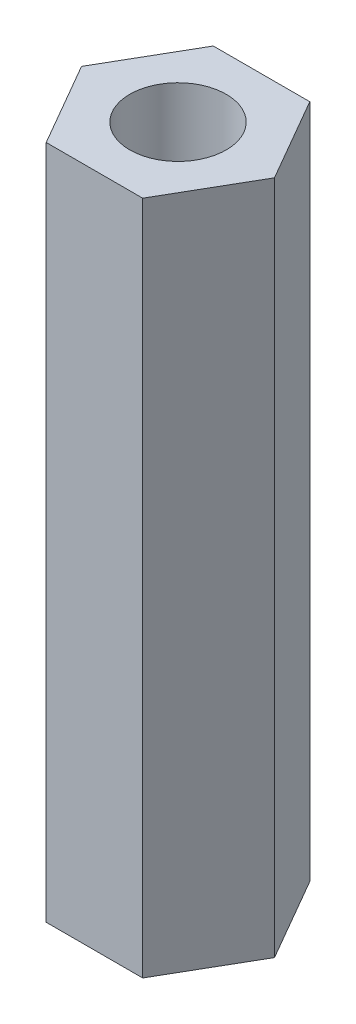
ISO-10303-21;
HEADER;
FILE_DESCRIPTION(('STEP AP214'),'2;1');
FILE_NAME('part.step','',(''),(''),'','','');
FILE_SCHEMA(('AUTOMOTIVE_DESIGN { 1 0 10303 214 1 1 1 1 }'));
ENDSEC;
DATA;
#1=APPLICATION_CONTEXT('core data for automotive mechanical design processes');
#2=APPLICATION_PROTOCOL_DEFINITION('international standard','automotive_design',2000,#1);
#3=PRODUCT_CONTEXT('',#1,'mechanical');
#4=PRODUCT('Part','Part','',(#3));
#5=PRODUCT_RELATED_PRODUCT_CATEGORY('part','',(#4));
#6=PRODUCT_DEFINITION_FORMATION('','',#4);
#7=PRODUCT_DEFINITION_CONTEXT('part definition',#1,'design');
#8=PRODUCT_DEFINITION('design','',#6,#7);
#9=PRODUCT_DEFINITION_SHAPE('','',#8);
#10=(LENGTH_UNIT() NAMED_UNIT(*) SI_UNIT(.MILLI.,.METRE.));
#11=(NAMED_UNIT(*) PLANE_ANGLE_UNIT() SI_UNIT($,.RADIAN.));
#12=(NAMED_UNIT(*) SI_UNIT($,.STERADIAN.) SOLID_ANGLE_UNIT());
#13=UNCERTAINTY_MEASURE_WITH_UNIT(LENGTH_MEASURE(1.E-05),#10,'distance_accuracy_value','');
#14=(GEOMETRIC_REPRESENTATION_CONTEXT(3) GLOBAL_UNCERTAINTY_ASSIGNED_CONTEXT((#13)) GLOBAL_UNIT_ASSIGNED_CONTEXT((#10,
#11,#12)) REPRESENTATION_CONTEXT('',''));
#15=CARTESIAN_POINT('',(0.,0.,0.));
#16=DIRECTION('',(0.,0.,1.));
#17=DIRECTION('',(1.,0.,0.));
#18=AXIS2_PLACEMENT_3D('',#15,#16,#17);
#19=CARTESIAN_POINT('',(0.,35.,0.));
#20=DIRECTION('',(0.,1.,0.));
#21=DIRECTION('',(0.,0.,1.));
#22=AXIS2_PLACEMENT_3D('',#19,#20,#21);
#23=PLANE('',#22);
#24=DIRECTION('',(0.5,0.,0.866025403784439));
#25=VECTOR('',#24,1.);
#26=CARTESIAN_POINT('',(-4.99999999999991,35.,0.));
#27=LINE('',#26,#25);
#28=CARTESIAN_POINT('',(-4.99999999999991,35.,0.));
#29=VERTEX_POINT('',#28);
#30=CARTESIAN_POINT('',(-2.49999999999996,35.,4.33012701892211));
#31=VERTEX_POINT('',#30);
#32=EDGE_CURVE('E131',#29,#31,#27,.T.);
#33=ORIENTED_EDGE('',*,*,#32,.T.);
#34=DIRECTION('',(1.,0.,0.));
#35=VECTOR('',#34,1.);
#36=CARTESIAN_POINT('',(-2.49999999999996,35.,4.33012701892211));
#37=LINE('',#36,#35);
#38=CARTESIAN_POINT('',(2.49999999999995,35.,4.33012701892211));
#39=VERTEX_POINT('',#38);
#40=EDGE_CURVE('E89',#31,#39,#37,.T.);
#41=ORIENTED_EDGE('',*,*,#40,.T.);
#42=DIRECTION('',(0.5,0.,-0.866025403784438));
#43=VECTOR('',#42,1.);
#44=CARTESIAN_POINT('',(2.49999999999995,35.,4.33012701892211));
#45=LINE('',#44,#43);
#46=CARTESIAN_POINT('',(4.99999999999991,35.,0.));
#47=VERTEX_POINT('',#46);
#48=EDGE_CURVE('E102',#39,#47,#45,.T.);
#49=ORIENTED_EDGE('',*,*,#48,.T.);
#50=DIRECTION('',(-0.5,0.,-0.866025403784439));
#51=VECTOR('',#50,1.);
#52=CARTESIAN_POINT('',(4.99999999999991,35.,0.));
#53=LINE('',#52,#51);
#54=CARTESIAN_POINT('',(2.49999999999996,35.,-4.33012701892212));
#55=VERTEX_POINT('',#54);
#56=EDGE_CURVE('E96',#47,#55,#53,.T.);
#57=ORIENTED_EDGE('',*,*,#56,.T.);
#58=DIRECTION('',(-1.,0.,0.));
#59=VECTOR('',#58,1.);
#60=CARTESIAN_POINT('',(2.49999999999996,35.,-4.33012701892212));
#61=LINE('',#60,#59);
#62=CARTESIAN_POINT('',(-2.49999999999995,35.,-4.33012701892212));
#63=VERTEX_POINT('',#62);
#64=EDGE_CURVE('E100',#55,#63,#61,.T.);
#65=ORIENTED_EDGE('',*,*,#64,.T.);
#66=DIRECTION('',(-0.5,0.,0.866025403784438));
#67=VECTOR('',#66,1.);
#68=CARTESIAN_POINT('',(-2.49999999999995,35.,-4.33012701892212));
#69=LINE('',#68,#67);
#70=EDGE_CURVE('E52',#63,#29,#69,.T.);
#71=ORIENTED_EDGE('',*,*,#70,.T.);
#72=EDGE_LOOP('',(#33,#41,#49,#57,#65,#71));
#73=FACE_BOUND('',#72,.T.);
#74=CARTESIAN_POINT('',(0.,35.,0.));
#75=DIRECTION('',(0.,1.,0.));
#76=DIRECTION('',(0.,0.,1.));
#77=AXIS2_PLACEMENT_3D('',#74,#75,#76);
#78=CIRCLE('',#77,2.5);
#79=CARTESIAN_POINT('',(0.,35.,2.5));
#80=VERTEX_POINT('',#79);
#81=EDGE_CURVE('E124',#80,#80,#78,.T.);
#82=ORIENTED_EDGE('',*,*,#81,.F.);
#83=EDGE_LOOP('',(#82));
#84=FACE_BOUND('',#83,.T.);
#85=ADVANCED_FACE('F35',(#73,#84),#23,.T.);
#86=CARTESIAN_POINT('',(0.,0.,0.));
#87=DIRECTION('',(0.,1.,0.));
#88=DIRECTION('',(0.,0.,1.));
#89=AXIS2_PLACEMENT_3D('',#86,#87,#88);
#90=PLANE('',#89);
#91=DIRECTION('',(0.5,0.,0.866025403784439));
#92=VECTOR('',#91,1.);
#93=CARTESIAN_POINT('',(-4.99999999999991,0.,0.));
#94=LINE('',#93,#92);
#95=CARTESIAN_POINT('',(-4.99999999999991,0.,0.));
#96=VERTEX_POINT('',#95);
#97=CARTESIAN_POINT('',(-2.49999999999996,0.,4.33012701892211));
#98=VERTEX_POINT('',#97);
#99=EDGE_CURVE('E120',#96,#98,#94,.T.);
#100=ORIENTED_EDGE('',*,*,#99,.F.);
#101=DIRECTION('',(-0.5,0.,0.866025403784438));
#102=VECTOR('',#101,1.);
#103=CARTESIAN_POINT('',(-2.49999999999995,0.,-4.33012701892212));
#104=LINE('',#103,#102);
#105=CARTESIAN_POINT('',(-2.49999999999995,0.,-4.33012701892212));
#106=VERTEX_POINT('',#105);
#107=EDGE_CURVE('E81',#106,#96,#104,.T.);
#108=ORIENTED_EDGE('',*,*,#107,.F.);
#109=DIRECTION('',(-1.,0.,0.));
#110=VECTOR('',#109,1.);
#111=CARTESIAN_POINT('',(2.49999999999996,0.,-4.33012701892212));
#112=LINE('',#111,#110);
#113=CARTESIAN_POINT('',(2.49999999999996,0.,-4.33012701892212));
#114=VERTEX_POINT('',#113);
#115=EDGE_CURVE('E75',#114,#106,#112,.T.);
#116=ORIENTED_EDGE('',*,*,#115,.F.);
#117=DIRECTION('',(-0.5,0.,-0.866025403784439));
#118=VECTOR('',#117,1.);
#119=CARTESIAN_POINT('',(4.99999999999991,0.,0.));
#120=LINE('',#119,#118);
#121=CARTESIAN_POINT('',(4.99999999999991,0.,0.));
#122=VERTEX_POINT('',#121);
#123=EDGE_CURVE('E110',#122,#114,#120,.T.);
#124=ORIENTED_EDGE('',*,*,#123,.F.);
#125=DIRECTION('',(0.5,0.,-0.866025403784438));
#126=VECTOR('',#125,1.);
#127=CARTESIAN_POINT('',(2.49999999999995,0.,4.33012701892211));
#128=LINE('',#127,#126);
#129=CARTESIAN_POINT('',(2.49999999999995,0.,4.33012701892211));
#130=VERTEX_POINT('',#129);
#131=EDGE_CURVE('E126',#130,#122,#128,.T.);
#132=ORIENTED_EDGE('',*,*,#131,.F.);
#133=DIRECTION('',(1.,0.,0.));
#134=VECTOR('',#133,1.);
#135=CARTESIAN_POINT('',(-2.49999999999996,0.,4.33012701892211));
#136=LINE('',#135,#134);
#137=EDGE_CURVE('E123',#98,#130,#136,.T.);
#138=ORIENTED_EDGE('',*,*,#137,.F.);
#139=EDGE_LOOP('',(#100,#108,#116,#124,#132,#138));
#140=FACE_BOUND('',#139,.T.);
#141=CARTESIAN_POINT('',(0.,0.,0.));
#142=DIRECTION('',(0.,1.,0.));
#143=DIRECTION('',(0.,0.,1.));
#144=AXIS2_PLACEMENT_3D('',#141,#142,#143);
#145=CIRCLE('',#144,2.5);
#146=CARTESIAN_POINT('',(0.,0.,2.5));
#147=VERTEX_POINT('',#146);
#148=EDGE_CURVE('E224',#147,#147,#145,.T.);
#149=ORIENTED_EDGE('',*,*,#148,.T.);
#150=EDGE_LOOP('',(#149));
#151=FACE_BOUND('',#150,.T.);
#152=ADVANCED_FACE('F140',(#140,#151),#90,.F.);
#153=CARTESIAN_POINT('',(-4.99999999999991,35.,0.));
#154=DIRECTION('',(0.866025403784439,0.,-0.5));
#155=DIRECTION('',(-0.5,0.,-0.866025403784439));
#156=AXIS2_PLACEMENT_3D('',#153,#154,#155);
#157=PLANE('',#156);
#158=ORIENTED_EDGE('',*,*,#99,.T.);
#159=DIRECTION('',(0.,-1.,0.));
#160=VECTOR('',#159,1.);
#161=CARTESIAN_POINT('',(-2.49999999999996,35.,4.33012701892211));
#162=LINE('',#161,#160);
#163=EDGE_CURVE('E11',#31,#98,#162,.T.);
#164=ORIENTED_EDGE('',*,*,#163,.F.);
#165=ORIENTED_EDGE('',*,*,#32,.F.);
#166=DIRECTION('',(0.,-1.,0.));
#167=VECTOR('',#166,1.);
#168=CARTESIAN_POINT('',(-4.99999999999991,35.,0.));
#169=LINE('',#168,#167);
#170=EDGE_CURVE('E116',#29,#96,#169,.T.);
#171=ORIENTED_EDGE('',*,*,#170,.T.);
#172=EDGE_LOOP('',(#158,#164,#165,#171));
#173=FACE_BOUND('',#172,.T.);
#174=ADVANCED_FACE('F37',(#173),#157,.F.);
#175=CARTESIAN_POINT('',(-2.49999999999996,35.,4.33012701892211));
#176=DIRECTION('',(0.,0.,-1.));
#177=DIRECTION('',(-1.,0.,0.));
#178=AXIS2_PLACEMENT_3D('',#175,#176,#177);
#179=PLANE('',#178);
#180=ORIENTED_EDGE('',*,*,#137,.T.);
#181=DIRECTION('',(0.,-1.,0.));
#182=VECTOR('',#181,1.);
#183=CARTESIAN_POINT('',(2.49999999999995,35.,4.33012701892211));
#184=LINE('',#183,#182);
#185=EDGE_CURVE('E44',#39,#130,#184,.T.);
#186=ORIENTED_EDGE('',*,*,#185,.F.);
#187=ORIENTED_EDGE('',*,*,#40,.F.);
#188=ORIENTED_EDGE('',*,*,#163,.T.);
#189=EDGE_LOOP('',(#180,#186,#187,#188));
#190=FACE_BOUND('',#189,.T.);
#191=ADVANCED_FACE('F165',(#190),#179,.F.);
#192=CARTESIAN_POINT('',(2.49999999999995,35.,4.33012701892211));
#193=DIRECTION('',(-0.866025403784438,0.,-0.5));
#194=DIRECTION('',(-0.5,0.,0.866025403784438));
#195=AXIS2_PLACEMENT_3D('',#192,#193,#194);
#196=PLANE('',#195);
#197=ORIENTED_EDGE('',*,*,#131,.T.);
#198=DIRECTION('',(0.,-1.,0.));
#199=VECTOR('',#198,1.);
#200=CARTESIAN_POINT('',(4.99999999999991,35.,0.));
#201=LINE('',#200,#199);
#202=EDGE_CURVE('E111',#47,#122,#201,.T.);
#203=ORIENTED_EDGE('',*,*,#202,.F.);
#204=ORIENTED_EDGE('',*,*,#48,.F.);
#205=ORIENTED_EDGE('',*,*,#185,.T.);
#206=EDGE_LOOP('',(#197,#203,#204,#205));
#207=FACE_BOUND('',#206,.T.);
#208=ADVANCED_FACE('F137',(#207),#196,.F.);
#209=CARTESIAN_POINT('',(4.99999999999991,35.,0.));
#210=DIRECTION('',(-0.866025403784439,0.,0.5));
#211=DIRECTION('',(0.5,0.,0.866025403784439));
#212=AXIS2_PLACEMENT_3D('',#209,#210,#211);
#213=PLANE('',#212);
#214=ORIENTED_EDGE('',*,*,#123,.T.);
#215=DIRECTION('',(0.,-1.,0.));
#216=VECTOR('',#215,1.);
#217=CARTESIAN_POINT('',(2.49999999999996,35.,-4.33012701892212));
#218=LINE('',#217,#216);
#219=EDGE_CURVE('E107',#55,#114,#218,.T.);
#220=ORIENTED_EDGE('',*,*,#219,.F.);
#221=ORIENTED_EDGE('',*,*,#56,.F.);
#222=ORIENTED_EDGE('',*,*,#202,.T.);
#223=EDGE_LOOP('',(#214,#220,#221,#222));
#224=FACE_BOUND('',#223,.T.);
#225=ADVANCED_FACE('F108',(#224),#213,.F.);
#226=CARTESIAN_POINT('',(2.49999999999996,35.,-4.33012701892212));
#227=DIRECTION('',(0.,0.,1.));
#228=DIRECTION('',(1.,0.,0.));
#229=AXIS2_PLACEMENT_3D('',#226,#227,#228);
#230=PLANE('',#229);
#231=ORIENTED_EDGE('',*,*,#115,.T.);
#232=DIRECTION('',(0.,-1.,0.));
#233=VECTOR('',#232,1.);
#234=CARTESIAN_POINT('',(-2.49999999999995,35.,-4.33012701892212));
#235=LINE('',#234,#233);
#236=EDGE_CURVE('E112',#63,#106,#235,.T.);
#237=ORIENTED_EDGE('',*,*,#236,.F.);
#238=ORIENTED_EDGE('',*,*,#64,.F.);
#239=ORIENTED_EDGE('',*,*,#219,.T.);
#240=EDGE_LOOP('',(#231,#237,#238,#239));
#241=FACE_BOUND('',#240,.T.);
#242=ADVANCED_FACE('F114',(#241),#230,.F.);
#243=CARTESIAN_POINT('',(-2.49999999999995,35.,-4.33012701892212));
#244=DIRECTION('',(0.866025403784439,0.,0.5));
#245=DIRECTION('',(0.5,0.,-0.866025403784439));
#246=AXIS2_PLACEMENT_3D('',#243,#244,#245);
#247=PLANE('',#246);
#248=ORIENTED_EDGE('',*,*,#107,.T.);
#249=ORIENTED_EDGE('',*,*,#170,.F.);
#250=ORIENTED_EDGE('',*,*,#70,.F.);
#251=ORIENTED_EDGE('',*,*,#236,.T.);
#252=EDGE_LOOP('',(#248,#249,#250,#251));
#253=FACE_BOUND('',#252,.T.);
#254=ADVANCED_FACE('F145',(#253),#247,.F.);
#255=CARTESIAN_POINT('',(0.,35.,0.));
#256=DIRECTION('',(0.,-1.,0.));
#257=DIRECTION('',(0.,0.,-1.));
#258=AXIS2_PLACEMENT_3D('',#255,#256,#257);
#259=CYLINDRICAL_SURFACE('',#258,2.5);
#260=ORIENTED_EDGE('',*,*,#81,.T.);
#261=EDGE_LOOP('',(#260));
#262=FACE_BOUND('',#261,.T.);
#263=ORIENTED_EDGE('',*,*,#148,.F.);
#264=EDGE_LOOP('',(#263));
#265=FACE_BOUND('',#264,.T.);
#266=ADVANCED_FACE('F147',(#262,#265),#259,.F.);
#267=CLOSED_SHELL('',(#85,#152,#174,#191,#208,#225,#242,#254,#266));
#268=MANIFOLD_SOLID_BREP('B2',#267);
#269=ADVANCED_BREP_SHAPE_REPRESENTATION('',(#18,#268),#14);
#270=SHAPE_DEFINITION_REPRESENTATION(#9,#269);
ENDSEC;
END-ISO-10303-21;
